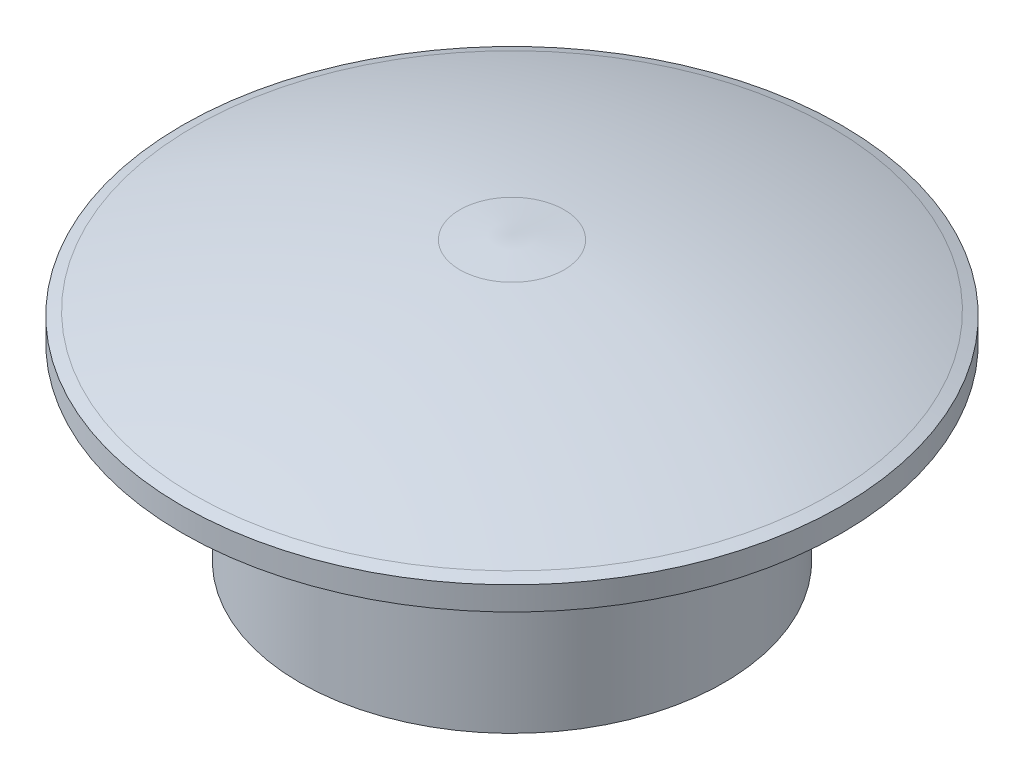
ISO-10303-21;
HEADER;
FILE_DESCRIPTION(('STEP AP214'),'2;1');
FILE_NAME('part.step','',(''),(''),'','','');
FILE_SCHEMA(('AUTOMOTIVE_DESIGN { 1 0 10303 214 1 1 1 1 }'));
ENDSEC;
DATA;
#1=APPLICATION_CONTEXT('core data for automotive mechanical design processes');
#2=APPLICATION_PROTOCOL_DEFINITION('international standard','automotive_design',2000,#1);
#3=PRODUCT_CONTEXT('',#1,'mechanical');
#4=PRODUCT('Part','Part','',(#3));
#5=PRODUCT_RELATED_PRODUCT_CATEGORY('part','',(#4));
#6=PRODUCT_DEFINITION_FORMATION('','',#4);
#7=PRODUCT_DEFINITION_CONTEXT('part definition',#1,'design');
#8=PRODUCT_DEFINITION('design','',#6,#7);
#9=PRODUCT_DEFINITION_SHAPE('','',#8);
#10=(LENGTH_UNIT() NAMED_UNIT(*) SI_UNIT(.MILLI.,.METRE.));
#11=(NAMED_UNIT(*) PLANE_ANGLE_UNIT() SI_UNIT($,.RADIAN.));
#12=(NAMED_UNIT(*) SI_UNIT($,.STERADIAN.) SOLID_ANGLE_UNIT());
#13=UNCERTAINTY_MEASURE_WITH_UNIT(LENGTH_MEASURE(1.E-05),#10,'distance_accuracy_value','');
#14=(GEOMETRIC_REPRESENTATION_CONTEXT(3) GLOBAL_UNCERTAINTY_ASSIGNED_CONTEXT((#13)) GLOBAL_UNIT_ASSIGNED_CONTEXT((#10,
#11,#12)) REPRESENTATION_CONTEXT('',''));
#15=CARTESIAN_POINT('',(0.,0.,0.));
#16=DIRECTION('',(0.,0.,1.));
#17=DIRECTION('',(1.,0.,0.));
#18=AXIS2_PLACEMENT_3D('',#15,#16,#17);
#19=CARTESIAN_POINT('',(0.,5.61853864223907,0.));
#20=DIRECTION('',(0.,-1.,0.));
#21=DIRECTION('',(0.,0.,-1.));
#22=AXIS2_PLACEMENT_3D('',#19,#20,#21);
#23=CONICAL_SURFACE('',#22,4.02137322148594,1.47622083528847);
#24=CARTESIAN_POINT('',(0.,5.8950702292357,0.));
#25=DIRECTION('',(0.,1.,0.));
#26=DIRECTION('',(0.,0.,1.));
#27=AXIS2_PLACEMENT_3D('',#24,#25,#26);
#28=CIRCLE('',#27,1.10617173064396);
#29=CARTESIAN_POINT('',(0.,5.8950702292357,1.10617173064396));
#30=VERTEX_POINT('',#29);
#31=EDGE_CURVE('E41',#30,#30,#28,.T.);
#32=ORIENTED_EDGE('',*,*,#31,.T.);
#33=EDGE_LOOP('',(#32));
#34=FACE_BOUND('',#33,.T.);
#35=CARTESIAN_POINT('',(0.,6.,0.));
#36=VERTEX_POINT('',#35);
#37=VERTEX_LOOP('',#36);
#38=FACE_BOUND('',#37,.T.);
#39=ADVANCED_FACE('F33',(#34,#38),#23,.T.);
#40=CARTESIAN_POINT('',(0.,4.5,0.));
#41=DIRECTION('',(0.,-1.,0.));
#42=DIRECTION('',(0.,0.,-1.));
#43=AXIS2_PLACEMENT_3D('',#40,#41,#42);
#44=CONICAL_SURFACE('',#43,7.,1.21156845694377);
#45=CARTESIAN_POINT('',(0.,4.58909469008038,0.));
#46=DIRECTION('',(0.,1.,0.));
#47=DIRECTION('',(0.,0.,1.));
#48=AXIS2_PLACEMENT_3D('',#45,#46,#47);
#49=CIRCLE('',#48,6.76274415592332);
#50=CARTESIAN_POINT('',(0.,4.58909469008038,6.76274415592332));
#51=VERTEX_POINT('',#50);
#52=EDGE_CURVE('E11',#51,#51,#49,.F.);
#53=ORIENTED_EDGE('',*,*,#52,.T.);
#54=EDGE_LOOP('',(#53));
#55=FACE_BOUND('',#54,.T.);
#56=CARTESIAN_POINT('',(0.,4.5,0.));
#57=DIRECTION('',(0.,1.,0.));
#58=DIRECTION('',(0.,0.,1.));
#59=AXIS2_PLACEMENT_3D('',#56,#57,#58);
#60=CIRCLE('',#59,7.);
#61=CARTESIAN_POINT('',(0.,4.5,7.));
#62=VERTEX_POINT('',#61);
#63=EDGE_CURVE('E131',#62,#62,#60,.T.);
#64=ORIENTED_EDGE('',*,*,#63,.T.);
#65=EDGE_LOOP('',(#64));
#66=FACE_BOUND('',#65,.T.);
#67=ADVANCED_FACE('F63',(#55,#66),#44,.T.);
#68=CARTESIAN_POINT('',(0.,6.,0.));
#69=DIRECTION('',(0.,1.,0.));
#70=DIRECTION('',(0.,0.,1.));
#71=AXIS2_PLACEMENT_3D('',#68,#69,#70);
#72=CYLINDRICAL_SURFACE('',#71,7.);
#73=ORIENTED_EDGE('',*,*,#63,.F.);
#74=EDGE_LOOP('',(#73));
#75=FACE_BOUND('',#74,.T.);
#76=CARTESIAN_POINT('',(0.,4.,0.));
#77=DIRECTION('',(0.,1.,0.));
#78=DIRECTION('',(0.,0.,1.));
#79=AXIS2_PLACEMENT_3D('',#76,#77,#78);
#80=CIRCLE('',#79,7.);
#81=CARTESIAN_POINT('',(0.,4.,7.));
#82=VERTEX_POINT('',#81);
#83=EDGE_CURVE('E128',#82,#82,#80,.T.);
#84=ORIENTED_EDGE('',*,*,#83,.T.);
#85=EDGE_LOOP('',(#84));
#86=FACE_BOUND('',#85,.T.);
#87=ADVANCED_FACE('F68',(#75,#86),#72,.T.);
#88=CARTESIAN_POINT('',(4.5,4.,0.));
#89=DIRECTION('',(0.,1.,0.));
#90=DIRECTION('',(0.,0.,1.));
#91=AXIS2_PLACEMENT_3D('',#88,#89,#90);
#92=PLANE('',#91);
#93=ORIENTED_EDGE('',*,*,#83,.F.);
#94=EDGE_LOOP('',(#93));
#95=FACE_BOUND('',#94,.T.);
#96=CARTESIAN_POINT('',(0.,4.,0.));
#97=DIRECTION('',(0.,1.,0.));
#98=DIRECTION('',(0.,0.,1.));
#99=AXIS2_PLACEMENT_3D('',#96,#97,#98);
#100=CIRCLE('',#99,4.5);
#101=CARTESIAN_POINT('',(0.,4.,4.5));
#102=VERTEX_POINT('',#101);
#103=EDGE_CURVE('E124',#102,#102,#100,.T.);
#104=ORIENTED_EDGE('',*,*,#103,.T.);
#105=EDGE_LOOP('',(#104));
#106=FACE_BOUND('',#105,.T.);
#107=ADVANCED_FACE('F75',(#95,#106),#92,.F.);
#108=CARTESIAN_POINT('',(0.,6.,0.));
#109=DIRECTION('',(0.,1.,0.));
#110=DIRECTION('',(0.,0.,1.));
#111=AXIS2_PLACEMENT_3D('',#108,#109,#110);
#112=CYLINDRICAL_SURFACE('',#111,4.5);
#113=ORIENTED_EDGE('',*,*,#103,.F.);
#114=EDGE_LOOP('',(#113));
#115=FACE_BOUND('',#114,.T.);
#116=CARTESIAN_POINT('',(0.,0.,0.));
#117=DIRECTION('',(0.,1.,0.));
#118=DIRECTION('',(0.,0.,1.));
#119=AXIS2_PLACEMENT_3D('',#116,#117,#118);
#120=CIRCLE('',#119,4.5);
#121=CARTESIAN_POINT('',(0.,0.,4.5));
#122=VERTEX_POINT('',#121);
#123=EDGE_CURVE('E121',#122,#122,#120,.T.);
#124=ORIENTED_EDGE('',*,*,#123,.T.);
#125=EDGE_LOOP('',(#124));
#126=FACE_BOUND('',#125,.T.);
#127=ADVANCED_FACE('F79',(#115,#126),#112,.T.);
#128=CARTESIAN_POINT('',(0.,0.,0.));
#129=DIRECTION('',(0.,1.,0.));
#130=DIRECTION('',(0.,0.,1.));
#131=AXIS2_PLACEMENT_3D('',#128,#129,#130);
#132=PLANE('',#131);
#133=CARTESIAN_POINT('',(0.,0.,0.));
#134=DIRECTION('',(0.,1.,0.));
#135=DIRECTION('',(0.,0.,1.));
#136=AXIS2_PLACEMENT_3D('',#133,#134,#135);
#137=CIRCLE('',#136,4.25);
#138=CARTESIAN_POINT('',(0.,0.,4.25));
#139=VERTEX_POINT('',#138);
#140=EDGE_CURVE('E115',#139,#139,#137,.T.);
#141=ORIENTED_EDGE('',*,*,#140,.T.);
#142=EDGE_LOOP('',(#141));
#143=FACE_BOUND('',#142,.T.);
#144=ORIENTED_EDGE('',*,*,#123,.F.);
#145=EDGE_LOOP('',(#144));
#146=FACE_BOUND('',#145,.T.);
#147=ADVANCED_FACE('F59',(#143,#146),#132,.F.);
#148=CARTESIAN_POINT('',(0.,-16.0066133268321,0.));
#149=DIRECTION('',(0.,-1.,0.));
#150=DIRECTION('',(0.,0.,-1.));
#151=AXIS2_PLACEMENT_3D('',#148,#149,#150);
#152=DEGENERATE_TOROIDAL_SURFACE('',#151,0.971388716098347,22.,.F.);
#153=ORIENTED_EDGE('',*,*,#52,.F.);
#154=EDGE_LOOP('',(#153));
#155=FACE_BOUND('',#154,.T.);
#156=ORIENTED_EDGE('',*,*,#31,.F.);
#157=EDGE_LOOP('',(#156));
#158=FACE_BOUND('',#157,.T.);
#159=ADVANCED_FACE('F35',(#155,#158),#152,.F.);
#160=CARTESIAN_POINT('',(0.,5.36965587455648,0.));
#161=DIRECTION('',(0.,-1.,0.));
#162=DIRECTION('',(0.,0.,-1.));
#163=AXIS2_PLACEMENT_3D('',#160,#161,#162);
#164=CONICAL_SURFACE('',#163,3.99776458004568,1.47622083528847);
#165=CARTESIAN_POINT('',(0.,5.64618746155311,0.));
#166=DIRECTION('',(0.,-1.,0.));
#167=DIRECTION('',(0.,0.,-1.));
#168=AXIS2_PLACEMENT_3D('',#165,#166,#167);
#169=CIRCLE('',#168,1.08256308920371);
#170=CARTESIAN_POINT('',(0.,5.64618746155311,-1.08256308920371));
#171=VERTEX_POINT('',#170);
#172=EDGE_CURVE('E112',#171,#171,#169,.F.);
#173=ORIENTED_EDGE('',*,*,#172,.F.);
#174=EDGE_LOOP('',(#173));
#175=FACE_BOUND('',#174,.T.);
#176=CARTESIAN_POINT('',(0.,5.74887775243761,0.));
#177=VERTEX_POINT('',#176);
#178=VERTEX_LOOP('',#177);
#179=FACE_BOUND('',#178,.T.);
#180=ADVANCED_FACE('F47',(#175,#179),#164,.F.);
#181=CARTESIAN_POINT('',(0.,4.26595786344418,0.));
#182=DIRECTION('',(0.,-1.,0.));
#183=DIRECTION('',(0.,0.,-1.));
#184=AXIS2_PLACEMENT_3D('',#181,#182,#183);
#185=CONICAL_SURFACE('',#184,6.9121121264543,1.21156845694377);
#186=CARTESIAN_POINT('',(0.,4.35505255352455,0.));
#187=DIRECTION('',(0.,-1.,0.));
#188=DIRECTION('',(0.,0.,-1.));
#189=AXIS2_PLACEMENT_3D('',#186,#187,#188);
#190=CIRCLE('',#189,6.67485628237762);
#191=CARTESIAN_POINT('',(0.,4.35505255352455,-6.67485628237762));
#192=VERTEX_POINT('',#191);
#193=EDGE_CURVE('E125',#192,#192,#190,.T.);
#194=ORIENTED_EDGE('',*,*,#193,.F.);
#195=EDGE_LOOP('',(#194));
#196=FACE_BOUND('',#195,.T.);
#197=CARTESIAN_POINT('',(0.,4.32683446575054,0.));
#198=DIRECTION('',(0.,-1.,0.));
#199=DIRECTION('',(0.,0.,-1.));
#200=AXIS2_PLACEMENT_3D('',#197,#198,#199);
#201=CIRCLE('',#200,6.75);
#202=CARTESIAN_POINT('',(0.,4.32683446575054,-6.75));
#203=VERTEX_POINT('',#202);
#204=EDGE_CURVE('E106',#203,#203,#201,.F.);
#205=ORIENTED_EDGE('',*,*,#204,.F.);
#206=EDGE_LOOP('',(#205));
#207=FACE_BOUND('',#206,.T.);
#208=ADVANCED_FACE('F49',(#196,#207),#185,.F.);
#209=CARTESIAN_POINT('',(0.,6.,0.));
#210=DIRECTION('',(0.,1.,0.));
#211=DIRECTION('',(0.,0.,1.));
#212=AXIS2_PLACEMENT_3D('',#209,#210,#211);
#213=CYLINDRICAL_SURFACE('',#212,6.75);
#214=ORIENTED_EDGE('',*,*,#204,.T.);
#215=EDGE_LOOP('',(#214));
#216=FACE_BOUND('',#215,.T.);
#217=CARTESIAN_POINT('',(0.,4.25,0.));
#218=DIRECTION('',(0.,1.,0.));
#219=DIRECTION('',(0.,0.,1.));
#220=AXIS2_PLACEMENT_3D('',#217,#218,#219);
#221=CIRCLE('',#220,6.75);
#222=CARTESIAN_POINT('',(0.,4.25,6.75));
#223=VERTEX_POINT('',#222);
#224=EDGE_CURVE('E109',#223,#223,#221,.T.);
#225=ORIENTED_EDGE('',*,*,#224,.F.);
#226=EDGE_LOOP('',(#225));
#227=FACE_BOUND('',#226,.T.);
#228=ADVANCED_FACE('F56',(#216,#227),#213,.F.);
#229=CARTESIAN_POINT('',(4.5,4.25,0.));
#230=DIRECTION('',(0.,1.,0.));
#231=DIRECTION('',(0.,0.,1.));
#232=AXIS2_PLACEMENT_3D('',#229,#230,#231);
#233=PLANE('',#232);
#234=ORIENTED_EDGE('',*,*,#224,.T.);
#235=EDGE_LOOP('',(#234));
#236=FACE_BOUND('',#235,.T.);
#237=CARTESIAN_POINT('',(0.,4.25,0.));
#238=DIRECTION('',(0.,1.,0.));
#239=DIRECTION('',(0.,0.,1.));
#240=AXIS2_PLACEMENT_3D('',#237,#238,#239);
#241=CIRCLE('',#240,4.25);
#242=CARTESIAN_POINT('',(0.,4.25,4.25));
#243=VERTEX_POINT('',#242);
#244=EDGE_CURVE('E110',#243,#243,#241,.T.);
#245=ORIENTED_EDGE('',*,*,#244,.F.);
#246=EDGE_LOOP('',(#245));
#247=FACE_BOUND('',#246,.T.);
#248=ADVANCED_FACE('F94',(#236,#247),#233,.T.);
#249=CARTESIAN_POINT('',(0.,6.,0.));
#250=DIRECTION('',(0.,1.,0.));
#251=DIRECTION('',(0.,0.,1.));
#252=AXIS2_PLACEMENT_3D('',#249,#250,#251);
#253=CYLINDRICAL_SURFACE('',#252,4.25);
#254=ORIENTED_EDGE('',*,*,#244,.T.);
#255=EDGE_LOOP('',(#254));
#256=FACE_BOUND('',#255,.T.);
#257=ORIENTED_EDGE('',*,*,#140,.F.);
#258=EDGE_LOOP('',(#257));
#259=FACE_BOUND('',#258,.T.);
#260=ADVANCED_FACE('F90',(#256,#259),#253,.F.);
#261=CARTESIAN_POINT('',(0.,-16.0066133268321,0.));
#262=DIRECTION('',(0.,-1.,0.));
#263=DIRECTION('',(0.,0.,-1.));
#264=AXIS2_PLACEMENT_3D('',#261,#262,#263);
#265=DEGENERATE_TOROIDAL_SURFACE('',#264,0.971388716098347,21.75,.F.);
#266=ORIENTED_EDGE('',*,*,#193,.T.);
#267=EDGE_LOOP('',(#266));
#268=FACE_BOUND('',#267,.T.);
#269=ORIENTED_EDGE('',*,*,#172,.T.);
#270=EDGE_LOOP('',(#269));
#271=FACE_BOUND('',#270,.T.);
#272=ADVANCED_FACE('F87',(#268,#271),#265,.T.);
#273=CLOSED_SHELL('',(#39,#67,#87,#107,#127,#147,#159,#180,#208,#228,#248,#260,#272));
#274=MANIFOLD_SOLID_BREP('B2',#273);
#275=ADVANCED_BREP_SHAPE_REPRESENTATION('',(#18,#274),#14);
#276=SHAPE_DEFINITION_REPRESENTATION(#9,#275);
ENDSEC;
END-ISO-10303-21;
